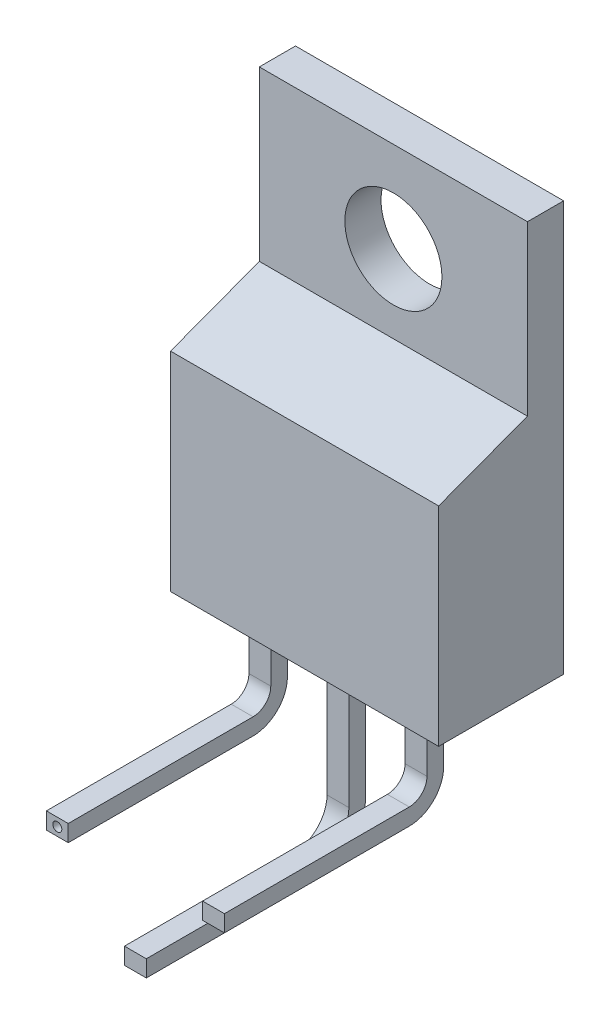
ISO-10303-21;
HEADER;
FILE_DESCRIPTION(('STEP AP214'),'2;1');
FILE_NAME('part.step','',(''),(''),'','','');
FILE_SCHEMA(('AUTOMOTIVE_DESIGN { 1 0 10303 214 1 1 1 1 }'));
ENDSEC;
DATA;
#1=APPLICATION_CONTEXT('core data for automotive mechanical design processes');
#2=APPLICATION_PROTOCOL_DEFINITION('international standard','automotive_design',2000,#1);
#3=PRODUCT_CONTEXT('',#1,'mechanical');
#4=PRODUCT('Part','Part','',(#3));
#5=PRODUCT_RELATED_PRODUCT_CATEGORY('part','',(#4));
#6=PRODUCT_DEFINITION_FORMATION('','',#4);
#7=PRODUCT_DEFINITION_CONTEXT('part definition',#1,'design');
#8=PRODUCT_DEFINITION('design','',#6,#7);
#9=PRODUCT_DEFINITION_SHAPE('','',#8);
#10=(LENGTH_UNIT() NAMED_UNIT(*) SI_UNIT(.MILLI.,.METRE.));
#11=(NAMED_UNIT(*) PLANE_ANGLE_UNIT() SI_UNIT($,.RADIAN.));
#12=(NAMED_UNIT(*) SI_UNIT($,.STERADIAN.) SOLID_ANGLE_UNIT());
#13=UNCERTAINTY_MEASURE_WITH_UNIT(LENGTH_MEASURE(1.E-05),#10,'distance_accuracy_value','');
#14=(GEOMETRIC_REPRESENTATION_CONTEXT(3) GLOBAL_UNCERTAINTY_ASSIGNED_CONTEXT((#13)) GLOBAL_UNIT_ASSIGNED_CONTEXT((#10,
#11,#12)) REPRESENTATION_CONTEXT('',''));
#15=CARTESIAN_POINT('',(0.,0.,0.));
#16=DIRECTION('',(0.,0.,1.));
#17=DIRECTION('',(1.,0.,0.));
#18=AXIS2_PLACEMENT_3D('',#15,#16,#17);
#19=CARTESIAN_POINT('',(-0.42,1.,-1.28));
#20=DIRECTION('',(0.,0.,-1.));
#21=DIRECTION('',(-1.,0.,0.));
#22=AXIS2_PLACEMENT_3D('',#19,#20,#21);
#23=PLANE('',#22);
#24=DIRECTION('',(0.,-1.,0.));
#25=VECTOR('',#24,1.);
#26=CARTESIAN_POINT('',(-0.0399999999999997,3.5,-1.28));
#27=LINE('',#26,#25);
#28=CARTESIAN_POINT('',(-0.0399999999999997,3.5,-1.28));
#29=VERTEX_POINT('',#28);
#30=CARTESIAN_POINT('',(-0.0399999999999997,1.,-1.28));
#31=VERTEX_POINT('',#30);
#32=EDGE_CURVE('E299',#29,#31,#27,.T.);
#33=ORIENTED_EDGE('',*,*,#32,.F.);
#34=DIRECTION('',(-1.,0.,0.));
#35=VECTOR('',#34,1.);
#36=CARTESIAN_POINT('',(-0.42,3.5,-1.28));
#37=LINE('',#36,#35);
#38=CARTESIAN_POINT('',(-0.880000000000001,3.5,-1.28));
#39=VERTEX_POINT('',#38);
#40=EDGE_CURVE('E418',#29,#39,#37,.T.);
#41=ORIENTED_EDGE('',*,*,#40,.T.);
#42=DIRECTION('',(0.,1.,0.));
#43=VECTOR('',#42,1.);
#44=CARTESIAN_POINT('',(-0.880000000000001,1.,-1.28));
#45=LINE('',#44,#43);
#46=CARTESIAN_POINT('',(-0.880000000000001,1.00000000000001,-1.28));
#47=VERTEX_POINT('',#46);
#48=EDGE_CURVE('E356',#47,#39,#45,.T.);
#49=ORIENTED_EDGE('',*,*,#48,.F.);
#50=DIRECTION('',(-1.,0.,0.));
#51=VECTOR('',#50,1.);
#52=CARTESIAN_POINT('',(-0.42,1.,-1.28));
#53=LINE('',#52,#51);
#54=EDGE_CURVE('E413',#31,#47,#53,.T.);
#55=ORIENTED_EDGE('',*,*,#54,.F.);
#56=EDGE_LOOP('',(#33,#41,#49,#55));
#57=FACE_BOUND('',#56,.T.);
#58=ADVANCED_FACE('F31',(#57),#23,.F.);
#59=CARTESIAN_POINT('',(-0.42,1.00000000000001,-1.92));
#60=DIRECTION('',(0.,0.,1.));
#61=DIRECTION('',(1.,0.,0.));
#62=AXIS2_PLACEMENT_3D('',#59,#60,#61);
#63=PLANE('',#62);
#64=DIRECTION('',(0.,1.,0.));
#65=VECTOR('',#64,1.);
#66=CARTESIAN_POINT('',(-0.0399999999999997,1.00000000000001,-1.92));
#67=LINE('',#66,#65);
#68=CARTESIAN_POINT('',(-0.0399999999999997,1.00000000000001,-1.92));
#69=VERTEX_POINT('',#68);
#70=CARTESIAN_POINT('',(-0.0399999999999997,3.5,-1.92));
#71=VERTEX_POINT('',#70);
#72=EDGE_CURVE('E294',#69,#71,#67,.T.);
#73=ORIENTED_EDGE('',*,*,#72,.F.);
#74=DIRECTION('',(1.,0.,0.));
#75=VECTOR('',#74,1.);
#76=CARTESIAN_POINT('',(-0.42,1.00000000000001,-1.92));
#77=LINE('',#76,#75);
#78=CARTESIAN_POINT('',(-0.880000000000001,1.00000000000001,-1.92));
#79=VERTEX_POINT('',#78);
#80=EDGE_CURVE('E410',#79,#69,#77,.T.);
#81=ORIENTED_EDGE('',*,*,#80,.F.);
#82=DIRECTION('',(0.,-1.,0.));
#83=VECTOR('',#82,1.);
#84=CARTESIAN_POINT('',(-0.880000000000001,3.5,-1.92));
#85=LINE('',#84,#83);
#86=CARTESIAN_POINT('',(-0.880000000000001,3.5,-1.92));
#87=VERTEX_POINT('',#86);
#88=EDGE_CURVE('E362',#87,#79,#85,.T.);
#89=ORIENTED_EDGE('',*,*,#88,.F.);
#90=DIRECTION('',(1.,0.,0.));
#91=VECTOR('',#90,1.);
#92=CARTESIAN_POINT('',(-0.42,3.5,-1.92));
#93=LINE('',#92,#91);
#94=EDGE_CURVE('E415',#87,#71,#93,.T.);
#95=ORIENTED_EDGE('',*,*,#94,.T.);
#96=EDGE_LOOP('',(#73,#81,#89,#95));
#97=FACE_BOUND('',#96,.T.);
#98=ADVANCED_FACE('F507',(#97),#63,.F.);
#99=CARTESIAN_POINT('',(0.,1.,-0.600000000000001));
#100=DIRECTION('',(1.,0.,0.));
#101=DIRECTION('',(0.,0.,-1.));
#102=AXIS2_PLACEMENT_3D('',#99,#100,#101);
#103=CYLINDRICAL_SURFACE('',#102,0.68);
#104=CARTESIAN_POINT('',(-0.0399999999999997,1.,-0.600000000000001));
#105=DIRECTION('',(-1.,0.,0.));
#106=DIRECTION('',(0.,0.,-1.));
#107=AXIS2_PLACEMENT_3D('',#104,#105,#106);
#108=CIRCLE('',#107,0.68);
#109=CARTESIAN_POINT('',(-0.0399999999999997,0.32,-0.600000000000001));
#110=VERTEX_POINT('',#109);
#111=EDGE_CURVE('E283',#31,#110,#108,.T.);
#112=ORIENTED_EDGE('',*,*,#111,.F.);
#113=ORIENTED_EDGE('',*,*,#54,.T.);
#114=CARTESIAN_POINT('',(-0.880000000000001,0.999999999999999,-0.600000000000001));
#115=DIRECTION('',(1.,0.,0.));
#116=DIRECTION('',(0.,-1.,0.));
#117=AXIS2_PLACEMENT_3D('',#114,#115,#116);
#118=CIRCLE('',#117,0.68);
#119=CARTESIAN_POINT('',(-0.88,0.32,-0.600000000000001));
#120=VERTEX_POINT('',#119);
#121=EDGE_CURVE('E353',#120,#47,#118,.T.);
#122=ORIENTED_EDGE('',*,*,#121,.F.);
#123=DIRECTION('',(-1.,0.,0.));
#124=VECTOR('',#123,1.);
#125=CARTESIAN_POINT('',(-0.42,0.32,-0.600000000000001));
#126=LINE('',#125,#124);
#127=EDGE_CURVE('E408',#110,#120,#126,.T.);
#128=ORIENTED_EDGE('',*,*,#127,.F.);
#129=EDGE_LOOP('',(#112,#113,#122,#128));
#130=FACE_BOUND('',#129,.T.);
#131=ADVANCED_FACE('F513',(#130),#103,.F.);
#132=CARTESIAN_POINT('',(0.,1.,-0.600000000000001));
#133=DIRECTION('',(1.,0.,0.));
#134=DIRECTION('',(0.,0.,-1.));
#135=AXIS2_PLACEMENT_3D('',#132,#133,#134);
#136=CYLINDRICAL_SURFACE('',#135,1.32);
#137=CARTESIAN_POINT('',(-0.0399999999999997,1.,-0.600000000000001));
#138=DIRECTION('',(1.,0.,0.));
#139=DIRECTION('',(0.,0.,-1.));
#140=AXIS2_PLACEMENT_3D('',#137,#138,#139);
#141=CIRCLE('',#140,1.32);
#142=CARTESIAN_POINT('',(-0.0399999999999997,-0.32,-0.600000000000001));
#143=VERTEX_POINT('',#142);
#144=EDGE_CURVE('E292',#143,#69,#141,.T.);
#145=ORIENTED_EDGE('',*,*,#144,.F.);
#146=DIRECTION('',(1.,0.,0.));
#147=VECTOR('',#146,1.);
#148=CARTESIAN_POINT('',(-0.42,-0.32,-0.600000000000001));
#149=LINE('',#148,#147);
#150=CARTESIAN_POINT('',(-0.88,-0.32,-0.600000000000001));
#151=VERTEX_POINT('',#150);
#152=EDGE_CURVE('E405',#151,#143,#149,.T.);
#153=ORIENTED_EDGE('',*,*,#152,.F.);
#154=CARTESIAN_POINT('',(-0.880000000000001,0.999999999999999,-0.600000000000001));
#155=DIRECTION('',(-1.,0.,0.));
#156=DIRECTION('',(0.,-1.,0.));
#157=AXIS2_PLACEMENT_3D('',#154,#155,#156);
#158=CIRCLE('',#157,1.32);
#159=EDGE_CURVE('E341',#79,#151,#158,.T.);
#160=ORIENTED_EDGE('',*,*,#159,.F.);
#161=ORIENTED_EDGE('',*,*,#80,.T.);
#162=EDGE_LOOP('',(#145,#153,#160,#161));
#163=FACE_BOUND('',#162,.T.);
#164=ADVANCED_FACE('F658',(#163),#136,.T.);
#165=CARTESIAN_POINT('',(-0.42,0.32,-0.600000000000001));
#166=DIRECTION('',(0.,1.,0.));
#167=DIRECTION('',(-1.,0.,0.));
#168=AXIS2_PLACEMENT_3D('',#165,#166,#167);
#169=PLANE('',#168);
#170=DIRECTION('',(-1.,0.,0.));
#171=VECTOR('',#170,1.);
#172=CARTESIAN_POINT('',(0.42,0.32,6.5));
#173=LINE('',#172,#171);
#174=CARTESIAN_POINT('',(-0.0399999999999997,0.32,6.5));
#175=VERTEX_POINT('',#174);
#176=CARTESIAN_POINT('',(-0.88,0.32,6.5));
#177=VERTEX_POINT('',#176);
#178=EDGE_CURVE('E370',#175,#177,#173,.T.);
#179=ORIENTED_EDGE('',*,*,#178,.F.);
#180=DIRECTION('',(0.,0.,1.));
#181=VECTOR('',#180,1.);
#182=CARTESIAN_POINT('',(-0.0399999999999997,0.32,-0.600000000000001));
#183=LINE('',#182,#181);
#184=EDGE_CURVE('E46',#110,#175,#183,.T.);
#185=ORIENTED_EDGE('',*,*,#184,.F.);
#186=ORIENTED_EDGE('',*,*,#127,.T.);
#187=DIRECTION('',(0.,0.,-1.));
#188=VECTOR('',#187,1.);
#189=CARTESIAN_POINT('',(-0.88,0.32,6.5));
#190=LINE('',#189,#188);
#191=EDGE_CURVE('E350',#177,#120,#190,.T.);
#192=ORIENTED_EDGE('',*,*,#191,.F.);
#193=EDGE_LOOP('',(#179,#185,#186,#192));
#194=FACE_BOUND('',#193,.T.);
#195=ADVANCED_FACE('F650',(#194),#169,.T.);
#196=CARTESIAN_POINT('',(-0.42,-0.32,-0.600000000000001));
#197=DIRECTION('',(0.,-1.,0.));
#198=DIRECTION('',(1.,0.,0.));
#199=AXIS2_PLACEMENT_3D('',#196,#197,#198);
#200=PLANE('',#199);
#201=ORIENTED_EDGE('',*,*,#152,.T.);
#202=DIRECTION('',(0.,0.,-1.));
#203=VECTOR('',#202,1.);
#204=CARTESIAN_POINT('',(-0.0399999999999997,-0.32,6.5));
#205=LINE('',#204,#203);
#206=CARTESIAN_POINT('',(-0.0399999999999997,-0.32,6.5));
#207=VERTEX_POINT('',#206);
#208=EDGE_CURVE('E290',#207,#143,#205,.T.);
#209=ORIENTED_EDGE('',*,*,#208,.F.);
#210=DIRECTION('',(1.,0.,0.));
#211=VECTOR('',#210,1.);
#212=CARTESIAN_POINT('',(-0.42,-0.32,6.5));
#213=LINE('',#212,#211);
#214=CARTESIAN_POINT('',(-0.88,-0.32,6.5));
#215=VERTEX_POINT('',#214);
#216=EDGE_CURVE('E372',#215,#207,#213,.T.);
#217=ORIENTED_EDGE('',*,*,#216,.F.);
#218=DIRECTION('',(0.,0.,1.));
#219=VECTOR('',#218,1.);
#220=CARTESIAN_POINT('',(-0.88,-0.32,-0.600000000000001));
#221=LINE('',#220,#219);
#222=EDGE_CURVE('E344',#151,#215,#221,.T.);
#223=ORIENTED_EDGE('',*,*,#222,.F.);
#224=EDGE_LOOP('',(#201,#209,#217,#223));
#225=FACE_BOUND('',#224,.T.);
#226=ADVANCED_FACE('F642',(#225),#200,.T.);
#227=CARTESIAN_POINT('',(0.42,0.32,6.5));
#228=DIRECTION('',(0.,0.,-1.));
#229=DIRECTION('',(-1.,0.,0.));
#230=AXIS2_PLACEMENT_3D('',#227,#228,#229);
#231=PLANE('',#230);
#232=CARTESIAN_POINT('',(-0.46,0.,6.5));
#233=DIRECTION('',(0.,0.,1.));
#234=DIRECTION('',(1.,0.,0.));
#235=AXIS2_PLACEMENT_3D('',#232,#233,#234);
#236=CIRCLE('',#235,0.172950305711624);
#237=CARTESIAN_POINT('',(-0.287049694288376,0.,6.5));
#238=VERTEX_POINT('',#237);
#239=EDGE_CURVE('E267',#238,#238,#236,.T.);
#240=ORIENTED_EDGE('',*,*,#239,.F.);
#241=EDGE_LOOP('',(#240));
#242=FACE_BOUND('',#241,.T.);
#243=DIRECTION('',(0.,-1.,0.));
#244=VECTOR('',#243,1.);
#245=CARTESIAN_POINT('',(-0.0399999999999997,0.32,6.5));
#246=LINE('',#245,#244);
#247=EDGE_CURVE('E288',#175,#207,#246,.T.);
#248=ORIENTED_EDGE('',*,*,#247,.F.);
#249=ORIENTED_EDGE('',*,*,#178,.T.);
#250=DIRECTION('',(0.,1.,0.));
#251=VECTOR('',#250,1.);
#252=CARTESIAN_POINT('',(-0.88,-0.32,6.5));
#253=LINE('',#252,#251);
#254=EDGE_CURVE('E347',#215,#177,#253,.T.);
#255=ORIENTED_EDGE('',*,*,#254,.F.);
#256=ORIENTED_EDGE('',*,*,#216,.T.);
#257=EDGE_LOOP('',(#248,#249,#255,#256));
#258=FACE_BOUND('',#257,.T.);
#259=ADVANCED_FACE('F633',(#242,#258),#231,.F.);
#260=CARTESIAN_POINT('',(5.5,1.00000000000001,-1.92));
#261=DIRECTION('',(0.,0.,1.));
#262=DIRECTION('',(1.,0.,0.));
#263=AXIS2_PLACEMENT_3D('',#260,#261,#262);
#264=PLANE('',#263);
#265=DIRECTION('',(0.,-1.,0.));
#266=VECTOR('',#265,1.);
#267=CARTESIAN_POINT('',(5.12,3.5,-1.92));
#268=LINE('',#267,#266);
#269=CARTESIAN_POINT('',(5.12,3.5,-1.92));
#270=VERTEX_POINT('',#269);
#271=CARTESIAN_POINT('',(5.12,1.00000000000001,-1.92));
#272=VERTEX_POINT('',#271);
#273=EDGE_CURVE('E315',#270,#272,#268,.T.);
#274=ORIENTED_EDGE('',*,*,#273,.F.);
#275=DIRECTION('',(1.,0.,0.));
#276=VECTOR('',#275,1.);
#277=CARTESIAN_POINT('',(5.5,3.5,-1.92));
#278=LINE('',#277,#276);
#279=CARTESIAN_POINT('',(5.96,3.5,-1.92));
#280=VERTEX_POINT('',#279);
#281=EDGE_CURVE('E403',#270,#280,#278,.T.);
#282=ORIENTED_EDGE('',*,*,#281,.T.);
#283=DIRECTION('',(0.,1.,0.));
#284=VECTOR('',#283,1.);
#285=CARTESIAN_POINT('',(5.96,1.00000000000001,-1.92));
#286=LINE('',#285,#284);
#287=CARTESIAN_POINT('',(5.96,1.00000000000001,-1.92));
#288=VERTEX_POINT('',#287);
#289=EDGE_CURVE('E332',#288,#280,#286,.T.);
#290=ORIENTED_EDGE('',*,*,#289,.F.);
#291=DIRECTION('',(1.,0.,0.));
#292=VECTOR('',#291,1.);
#293=CARTESIAN_POINT('',(5.5,1.00000000000001,-1.92));
#294=LINE('',#293,#292);
#295=EDGE_CURVE('E398',#272,#288,#294,.T.);
#296=ORIENTED_EDGE('',*,*,#295,.F.);
#297=EDGE_LOOP('',(#274,#282,#290,#296));
#298=FACE_BOUND('',#297,.T.);
#299=ADVANCED_FACE('F625',(#298),#264,.F.);
#300=CARTESIAN_POINT('',(5.5,1.,-1.28));
#301=DIRECTION('',(0.,0.,-1.));
#302=DIRECTION('',(-1.,0.,0.));
#303=AXIS2_PLACEMENT_3D('',#300,#301,#302);
#304=PLANE('',#303);
#305=DIRECTION('',(0.,1.,0.));
#306=VECTOR('',#305,1.);
#307=CARTESIAN_POINT('',(5.12,1.,-1.28));
#308=LINE('',#307,#306);
#309=CARTESIAN_POINT('',(5.12,1.,-1.28));
#310=VERTEX_POINT('',#309);
#311=CARTESIAN_POINT('',(5.12,3.5,-1.28));
#312=VERTEX_POINT('',#311);
#313=EDGE_CURVE('E310',#310,#312,#308,.T.);
#314=ORIENTED_EDGE('',*,*,#313,.F.);
#315=DIRECTION('',(-1.,0.,0.));
#316=VECTOR('',#315,1.);
#317=CARTESIAN_POINT('',(5.5,1.,-1.28));
#318=LINE('',#317,#316);
#319=CARTESIAN_POINT('',(5.96,1.,-1.28));
#320=VERTEX_POINT('',#319);
#321=EDGE_CURVE('E395',#320,#310,#318,.T.);
#322=ORIENTED_EDGE('',*,*,#321,.F.);
#323=DIRECTION('',(0.,-1.,0.));
#324=VECTOR('',#323,1.);
#325=CARTESIAN_POINT('',(5.96,3.5,-1.28));
#326=LINE('',#325,#324);
#327=CARTESIAN_POINT('',(5.96,3.5,-1.28));
#328=VERTEX_POINT('',#327);
#329=EDGE_CURVE('E338',#328,#320,#326,.T.);
#330=ORIENTED_EDGE('',*,*,#329,.F.);
#331=DIRECTION('',(-1.,0.,0.));
#332=VECTOR('',#331,1.);
#333=CARTESIAN_POINT('',(5.5,3.5,-1.28));
#334=LINE('',#333,#332);
#335=EDGE_CURVE('E400',#328,#312,#334,.T.);
#336=ORIENTED_EDGE('',*,*,#335,.T.);
#337=EDGE_LOOP('',(#314,#322,#330,#336));
#338=FACE_BOUND('',#337,.T.);
#339=ADVANCED_FACE('F617',(#338),#304,.F.);
#340=CARTESIAN_POINT('',(0.,1.,-0.600000000000001));
#341=DIRECTION('',(1.,0.,0.));
#342=DIRECTION('',(0.,0.,-1.));
#343=AXIS2_PLACEMENT_3D('',#340,#341,#342);
#344=CYLINDRICAL_SURFACE('',#343,1.32);
#345=CARTESIAN_POINT('',(5.12,1.,-0.600000000000001));
#346=DIRECTION('',(-1.,0.,0.));
#347=DIRECTION('',(0.,0.,1.));
#348=AXIS2_PLACEMENT_3D('',#345,#346,#347);
#349=CIRCLE('',#348,1.32);
#350=CARTESIAN_POINT('',(5.12,-0.32,-0.600000000000001));
#351=VERTEX_POINT('',#350);
#352=EDGE_CURVE('E301',#272,#351,#349,.T.);
#353=ORIENTED_EDGE('',*,*,#352,.F.);
#354=ORIENTED_EDGE('',*,*,#295,.T.);
#355=CARTESIAN_POINT('',(5.96,1.,-0.600000000000001));
#356=DIRECTION('',(1.,0.,0.));
#357=DIRECTION('',(0.,0.,-1.));
#358=AXIS2_PLACEMENT_3D('',#355,#356,#357);
#359=CIRCLE('',#358,1.32);
#360=CARTESIAN_POINT('',(5.96,-0.320000000000001,-0.600000000000001));
#361=VERTEX_POINT('',#360);
#362=EDGE_CURVE('E329',#361,#288,#359,.T.);
#363=ORIENTED_EDGE('',*,*,#362,.F.);
#364=DIRECTION('',(1.,0.,0.));
#365=VECTOR('',#364,1.);
#366=CARTESIAN_POINT('',(5.5,-0.320000000000001,-0.600000000000001));
#367=LINE('',#366,#365);
#368=EDGE_CURVE('E393',#351,#361,#367,.T.);
#369=ORIENTED_EDGE('',*,*,#368,.F.);
#370=EDGE_LOOP('',(#353,#354,#363,#369));
#371=FACE_BOUND('',#370,.T.);
#372=ADVANCED_FACE('F609',(#371),#344,.T.);
#373=CARTESIAN_POINT('',(0.,1.,-0.600000000000001));
#374=DIRECTION('',(1.,0.,0.));
#375=DIRECTION('',(0.,0.,-1.));
#376=AXIS2_PLACEMENT_3D('',#373,#374,#375);
#377=CYLINDRICAL_SURFACE('',#376,0.679999999999999);
#378=CARTESIAN_POINT('',(5.12,1.,-0.600000000000001));
#379=DIRECTION('',(1.,0.,0.));
#380=DIRECTION('',(0.,0.,1.));
#381=AXIS2_PLACEMENT_3D('',#378,#379,#380);
#382=CIRCLE('',#381,0.679999999999999);
#383=CARTESIAN_POINT('',(5.12,0.32,-0.600000000000001));
#384=VERTEX_POINT('',#383);
#385=EDGE_CURVE('E308',#384,#310,#382,.T.);
#386=ORIENTED_EDGE('',*,*,#385,.F.);
#387=DIRECTION('',(-1.,0.,0.));
#388=VECTOR('',#387,1.);
#389=CARTESIAN_POINT('',(5.5,0.320000000000001,-0.600000000000001));
#390=LINE('',#389,#388);
#391=CARTESIAN_POINT('',(5.96,0.320000000000001,-0.600000000000001));
#392=VERTEX_POINT('',#391);
#393=EDGE_CURVE('E390',#392,#384,#390,.T.);
#394=ORIENTED_EDGE('',*,*,#393,.F.);
#395=CARTESIAN_POINT('',(5.96,1.,-0.600000000000001));
#396=DIRECTION('',(-1.,0.,0.));
#397=DIRECTION('',(0.,0.,-1.));
#398=AXIS2_PLACEMENT_3D('',#395,#396,#397);
#399=CIRCLE('',#398,0.679999999999999);
#400=EDGE_CURVE('E317',#320,#392,#399,.T.);
#401=ORIENTED_EDGE('',*,*,#400,.F.);
#402=ORIENTED_EDGE('',*,*,#321,.T.);
#403=EDGE_LOOP('',(#386,#394,#401,#402));
#404=FACE_BOUND('',#403,.T.);
#405=ADVANCED_FACE('F601',(#404),#377,.F.);
#406=CARTESIAN_POINT('',(5.5,0.320000000000001,-0.600000000000001));
#407=DIRECTION('',(0.,1.,0.));
#408=DIRECTION('',(-1.,0.,0.));
#409=AXIS2_PLACEMENT_3D('',#406,#407,#408);
#410=PLANE('',#409);
#411=ORIENTED_EDGE('',*,*,#393,.T.);
#412=DIRECTION('',(0.,0.,-1.));
#413=VECTOR('',#412,1.);
#414=CARTESIAN_POINT('',(5.12,0.32,6.5));
#415=LINE('',#414,#413);
#416=CARTESIAN_POINT('',(5.12,0.32,6.5));
#417=VERTEX_POINT('',#416);
#418=EDGE_CURVE('E306',#417,#384,#415,.T.);
#419=ORIENTED_EDGE('',*,*,#418,.F.);
#420=DIRECTION('',(-1.,0.,0.));
#421=VECTOR('',#420,1.);
#422=CARTESIAN_POINT('',(5.5,0.320000000000001,6.5));
#423=LINE('',#422,#421);
#424=CARTESIAN_POINT('',(5.96,0.320000000000001,6.5));
#425=VERTEX_POINT('',#424);
#426=EDGE_CURVE('E365',#425,#417,#423,.T.);
#427=ORIENTED_EDGE('',*,*,#426,.F.);
#428=DIRECTION('',(0.,0.,1.));
#429=VECTOR('',#428,1.);
#430=CARTESIAN_POINT('',(5.96,0.320000000000001,-0.600000000000001));
#431=LINE('',#430,#429);
#432=EDGE_CURVE('E320',#392,#425,#431,.T.);
#433=ORIENTED_EDGE('',*,*,#432,.F.);
#434=EDGE_LOOP('',(#411,#419,#427,#433));
#435=FACE_BOUND('',#434,.T.);
#436=ADVANCED_FACE('F593',(#435),#410,.T.);
#437=CARTESIAN_POINT('',(5.5,-0.320000000000001,-0.600000000000001));
#438=DIRECTION('',(0.,-1.,0.));
#439=DIRECTION('',(1.,0.,0.));
#440=AXIS2_PLACEMENT_3D('',#437,#438,#439);
#441=PLANE('',#440);
#442=DIRECTION('',(1.,0.,0.));
#443=VECTOR('',#442,1.);
#444=CARTESIAN_POINT('',(4.66,-0.32,6.5));
#445=LINE('',#444,#443);
#446=CARTESIAN_POINT('',(5.12,-0.320000000000001,6.5));
#447=VERTEX_POINT('',#446);
#448=CARTESIAN_POINT('',(5.96,-0.320000000000001,6.5));
#449=VERTEX_POINT('',#448);
#450=EDGE_CURVE('E368',#447,#449,#445,.T.);
#451=ORIENTED_EDGE('',*,*,#450,.F.);
#452=DIRECTION('',(0.,0.,1.));
#453=VECTOR('',#452,1.);
#454=CARTESIAN_POINT('',(5.12,-0.32,-0.600000000000001));
#455=LINE('',#454,#453);
#456=EDGE_CURVE('E54',#351,#447,#455,.T.);
#457=ORIENTED_EDGE('',*,*,#456,.F.);
#458=ORIENTED_EDGE('',*,*,#368,.T.);
#459=DIRECTION('',(0.,0.,-1.));
#460=VECTOR('',#459,1.);
#461=CARTESIAN_POINT('',(5.96,-0.320000000000001,6.5));
#462=LINE('',#461,#460);
#463=EDGE_CURVE('E326',#449,#361,#462,.T.);
#464=ORIENTED_EDGE('',*,*,#463,.F.);
#465=EDGE_LOOP('',(#451,#457,#458,#464));
#466=FACE_BOUND('',#465,.T.);
#467=ADVANCED_FACE('F584',(#466),#441,.T.);
#468=CARTESIAN_POINT('',(5.5,0.320000000000001,6.5));
#469=DIRECTION('',(0.,0.,1.));
#470=DIRECTION('',(1.,0.,0.));
#471=AXIS2_PLACEMENT_3D('',#468,#469,#470);
#472=PLANE('',#471);
#473=ORIENTED_EDGE('',*,*,#426,.T.);
#474=DIRECTION('',(0.,1.,0.));
#475=VECTOR('',#474,1.);
#476=CARTESIAN_POINT('',(5.12,-0.32,6.5));
#477=LINE('',#476,#475);
#478=EDGE_CURVE('E304',#447,#417,#477,.T.);
#479=ORIENTED_EDGE('',*,*,#478,.F.);
#480=ORIENTED_EDGE('',*,*,#450,.T.);
#481=DIRECTION('',(0.,-1.,0.));
#482=VECTOR('',#481,1.);
#483=CARTESIAN_POINT('',(5.96,0.320000000000001,6.5));
#484=LINE('',#483,#482);
#485=EDGE_CURVE('E323',#425,#449,#484,.T.);
#486=ORIENTED_EDGE('',*,*,#485,.F.);
#487=EDGE_LOOP('',(#473,#479,#480,#486));
#488=FACE_BOUND('',#487,.T.);
#489=ADVANCED_FACE('F537',(#488),#472,.T.);
#490=CARTESIAN_POINT('',(-2.61,3.5,-4.8));
#491=DIRECTION('',(0.,-1.,0.));
#492=DIRECTION('',(0.,0.,-1.));
#493=AXIS2_PLACEMENT_3D('',#490,#491,#492);
#494=PLANE('',#493);
#495=ORIENTED_EDGE('',*,*,#40,.F.);
#496=DIRECTION('',(0.,0.,1.));
#497=VECTOR('',#496,1.);
#498=CARTESIAN_POINT('',(-0.0399999999999997,3.5,-1.92));
#499=LINE('',#498,#497);
#500=EDGE_CURVE('E297',#71,#29,#499,.T.);
#501=ORIENTED_EDGE('',*,*,#500,.F.);
#502=ORIENTED_EDGE('',*,*,#94,.F.);
#503=DIRECTION('',(0.,0.,-1.));
#504=VECTOR('',#503,1.);
#505=CARTESIAN_POINT('',(-0.880000000000001,3.5,-1.28));
#506=LINE('',#505,#504);
#507=EDGE_CURVE('E359',#39,#87,#506,.T.);
#508=ORIENTED_EDGE('',*,*,#507,.F.);
#509=EDGE_LOOP('',(#495,#501,#502,#508));
#510=FACE_BOUND('',#509,.T.);
#511=ORIENTED_EDGE('',*,*,#281,.F.);
#512=DIRECTION('',(0.,0.,-1.));
#513=VECTOR('',#512,1.);
#514=CARTESIAN_POINT('',(5.12,3.5,-1.28));
#515=LINE('',#514,#513);
#516=EDGE_CURVE('E313',#312,#270,#515,.T.);
#517=ORIENTED_EDGE('',*,*,#516,.F.);
#518=ORIENTED_EDGE('',*,*,#335,.F.);
#519=DIRECTION('',(0.,0.,1.));
#520=VECTOR('',#519,1.);
#521=CARTESIAN_POINT('',(5.96,3.5,-1.92));
#522=LINE('',#521,#520);
#523=EDGE_CURVE('E335',#280,#328,#522,.T.);
#524=ORIENTED_EDGE('',*,*,#523,.F.);
#525=EDGE_LOOP('',(#511,#517,#518,#524));
#526=FACE_BOUND('',#525,.T.);
#527=DIRECTION('',(0.,0.,-1.));
#528=VECTOR('',#527,1.);
#529=CARTESIAN_POINT('',(2.12,3.5,-4.8));
#530=LINE('',#529,#528);
#531=CARTESIAN_POINT('',(2.12,3.5,-1.28));
#532=VERTEX_POINT('',#531);
#533=CARTESIAN_POINT('',(2.12,3.5,-1.92));
#534=VERTEX_POINT('',#533);
#535=EDGE_CURVE('E11',#532,#534,#530,.T.);
#536=ORIENTED_EDGE('',*,*,#535,.F.);
#537=DIRECTION('',(1.,0.,0.));
#538=VECTOR('',#537,1.);
#539=CARTESIAN_POINT('',(-2.61,3.5,-1.28));
#540=LINE('',#539,#538);
#541=CARTESIAN_POINT('',(2.96,3.5,-1.28));
#542=VERTEX_POINT('',#541);
#543=EDGE_CURVE('E39',#532,#542,#540,.T.);
#544=ORIENTED_EDGE('',*,*,#543,.T.);
#545=DIRECTION('',(0.,0.,1.));
#546=VECTOR('',#545,1.);
#547=CARTESIAN_POINT('',(2.96,3.5,-4.8));
#548=LINE('',#547,#546);
#549=CARTESIAN_POINT('',(2.96,3.5,-1.92));
#550=VERTEX_POINT('',#549);
#551=EDGE_CURVE('E468',#550,#542,#548,.T.);
#552=ORIENTED_EDGE('',*,*,#551,.F.);
#553=DIRECTION('',(-1.,0.,0.));
#554=VECTOR('',#553,1.);
#555=CARTESIAN_POINT('',(-2.61,3.5,-1.92));
#556=LINE('',#555,#554);
#557=EDGE_CURVE('E473',#550,#534,#556,.T.);
#558=ORIENTED_EDGE('',*,*,#557,.T.);
#559=EDGE_LOOP('',(#536,#544,#552,#558));
#560=FACE_BOUND('',#559,.T.);
#561=DIRECTION('',(0.,0.,1.));
#562=VECTOR('',#561,1.);
#563=CARTESIAN_POINT('',(-2.61,3.5,0.));
#564=LINE('',#563,#562);
#565=CARTESIAN_POINT('',(-2.61,3.5,-4.8));
#566=VERTEX_POINT('',#565);
#567=CARTESIAN_POINT('',(-2.61,3.5,0.));
#568=VERTEX_POINT('',#567);
#569=EDGE_CURVE('E441',#566,#568,#564,.T.);
#570=ORIENTED_EDGE('',*,*,#569,.F.);
#571=DIRECTION('',(-1.,0.,0.));
#572=VECTOR('',#571,1.);
#573=CARTESIAN_POINT('',(-2.61,3.5,-4.8));
#574=LINE('',#573,#572);
#575=CARTESIAN_POINT('',(7.69,3.5,-4.8));
#576=VERTEX_POINT('',#575);
#577=EDGE_CURVE('E446',#576,#566,#574,.T.);
#578=ORIENTED_EDGE('',*,*,#577,.F.);
#579=DIRECTION('',(0.,0.,-1.));
#580=VECTOR('',#579,1.);
#581=CARTESIAN_POINT('',(7.69,3.5,0.));
#582=LINE('',#581,#580);
#583=CARTESIAN_POINT('',(7.69,3.5,0.));
#584=VERTEX_POINT('',#583);
#585=EDGE_CURVE('E456',#584,#576,#582,.T.);
#586=ORIENTED_EDGE('',*,*,#585,.F.);
#587=DIRECTION('',(1.,0.,0.));
#588=VECTOR('',#587,1.);
#589=CARTESIAN_POINT('',(-2.61,3.5,0.));
#590=LINE('',#589,#588);
#591=EDGE_CURVE('E453',#568,#584,#590,.T.);
#592=ORIENTED_EDGE('',*,*,#591,.F.);
#593=EDGE_LOOP('',(#570,#578,#586,#592));
#594=FACE_BOUND('',#593,.T.);
#595=ADVANCED_FACE('F476',(#510,#526,#560,#594),#494,.T.);
#596=CARTESIAN_POINT('',(-2.61,19.25,0.));
#597=DIRECTION('',(1.,0.,0.));
#598=DIRECTION('',(0.,0.,-1.));
#599=AXIS2_PLACEMENT_3D('',#596,#597,#598);
#600=PLANE('',#599);
#601=DIRECTION('',(0.,-0.351424300429918,0.936216300364047));
#602=VECTOR('',#601,1.);
#603=CARTESIAN_POINT('',(-2.61,12.78,-3.40999999999988));
#604=LINE('',#603,#602);
#605=CARTESIAN_POINT('',(-2.61,12.78,-3.40999999999988));
#606=VERTEX_POINT('',#605);
#607=CARTESIAN_POINT('',(-2.61,11.5,0.));
#608=VERTEX_POINT('',#607);
#609=EDGE_CURVE('E433',#606,#608,#604,.T.);
#610=ORIENTED_EDGE('',*,*,#609,.F.);
#611=DIRECTION('',(0.,-1.,0.));
#612=VECTOR('',#611,1.);
#613=CARTESIAN_POINT('',(-2.61,19.25,-3.40999999999988));
#614=LINE('',#613,#612);
#615=CARTESIAN_POINT('',(-2.61,19.25,-3.40999999999988));
#616=VERTEX_POINT('',#615);
#617=EDGE_CURVE('E431',#616,#606,#614,.T.);
#618=ORIENTED_EDGE('',*,*,#617,.F.);
#619=DIRECTION('',(0.,0.,1.));
#620=VECTOR('',#619,1.);
#621=CARTESIAN_POINT('',(-2.61,19.25,0.));
#622=LINE('',#621,#620);
#623=CARTESIAN_POINT('',(-2.61,19.25,-4.8));
#624=VERTEX_POINT('',#623);
#625=EDGE_CURVE('E442',#624,#616,#622,.T.);
#626=ORIENTED_EDGE('',*,*,#625,.F.);
#627=DIRECTION('',(0.,-1.,0.));
#628=VECTOR('',#627,1.);
#629=CARTESIAN_POINT('',(-2.61,19.25,-4.8));
#630=LINE('',#629,#628);
#631=EDGE_CURVE('E450',#624,#566,#630,.T.);
#632=ORIENTED_EDGE('',*,*,#631,.T.);
#633=ORIENTED_EDGE('',*,*,#569,.T.);
#634=DIRECTION('',(0.,-1.,0.));
#635=VECTOR('',#634,1.);
#636=CARTESIAN_POINT('',(-2.61,19.25,0.));
#637=LINE('',#636,#635);
#638=EDGE_CURVE('E466',#608,#568,#637,.T.);
#639=ORIENTED_EDGE('',*,*,#638,.F.);
#640=EDGE_LOOP('',(#610,#618,#626,#632,#633,#639));
#641=FACE_BOUND('',#640,.T.);
#642=ADVANCED_FACE('F33',(#641),#600,.F.);
#643=CARTESIAN_POINT('',(-2.61,19.25,0.));
#644=DIRECTION('',(0.,0.,-1.));
#645=DIRECTION('',(-1.,0.,0.));
#646=AXIS2_PLACEMENT_3D('',#643,#644,#645);
#647=PLANE('',#646);
#648=DIRECTION('',(0.,-1.,0.));
#649=VECTOR('',#648,1.);
#650=CARTESIAN_POINT('',(7.69,19.25,0.));
#651=LINE('',#650,#649);
#652=CARTESIAN_POINT('',(7.69,11.5,0.));
#653=VERTEX_POINT('',#652);
#654=EDGE_CURVE('E464',#653,#584,#651,.T.);
#655=ORIENTED_EDGE('',*,*,#654,.F.);
#656=DIRECTION('',(1.,0.,0.));
#657=VECTOR('',#656,1.);
#658=CARTESIAN_POINT('',(-11.0770301759235,11.5,0.));
#659=LINE('',#658,#657);
#660=EDGE_CURVE('E430',#608,#653,#659,.T.);
#661=ORIENTED_EDGE('',*,*,#660,.F.);
#662=ORIENTED_EDGE('',*,*,#638,.T.);
#663=ORIENTED_EDGE('',*,*,#591,.T.);
#664=EDGE_LOOP('',(#655,#661,#662,#663));
#665=FACE_BOUND('',#664,.T.);
#666=ADVANCED_FACE('F544',(#665),#647,.F.);
#667=CARTESIAN_POINT('',(7.69,19.25,0.));
#668=DIRECTION('',(-1.,0.,0.));
#669=DIRECTION('',(0.,0.,1.));
#670=AXIS2_PLACEMENT_3D('',#667,#668,#669);
#671=PLANE('',#670);
#672=DIRECTION('',(0.,0.,-1.));
#673=VECTOR('',#672,1.);
#674=CARTESIAN_POINT('',(7.69,19.25,0.));
#675=LINE('',#674,#673);
#676=CARTESIAN_POINT('',(7.69,19.25,-3.40999999999988));
#677=VERTEX_POINT('',#676);
#678=CARTESIAN_POINT('',(7.69,19.25,-4.8));
#679=VERTEX_POINT('',#678);
#680=EDGE_CURVE('E445',#677,#679,#675,.T.);
#681=ORIENTED_EDGE('',*,*,#680,.F.);
#682=DIRECTION('',(0.,-1.,0.));
#683=VECTOR('',#682,1.);
#684=CARTESIAN_POINT('',(7.69,19.25,-3.40999999999988));
#685=LINE('',#684,#683);
#686=CARTESIAN_POINT('',(7.69,12.78,-3.40999999999988));
#687=VERTEX_POINT('',#686);
#688=EDGE_CURVE('E424',#677,#687,#685,.T.);
#689=ORIENTED_EDGE('',*,*,#688,.T.);
#690=DIRECTION('',(0.,-0.351424300429918,0.936216300364047));
#691=VECTOR('',#690,1.);
#692=CARTESIAN_POINT('',(7.69,12.78,-3.40999999999988));
#693=LINE('',#692,#691);
#694=EDGE_CURVE('E427',#687,#653,#693,.T.);
#695=ORIENTED_EDGE('',*,*,#694,.T.);
#696=ORIENTED_EDGE('',*,*,#654,.T.);
#697=ORIENTED_EDGE('',*,*,#585,.T.);
#698=DIRECTION('',(0.,-1.,0.));
#699=VECTOR('',#698,1.);
#700=CARTESIAN_POINT('',(7.69,19.25,-4.8));
#701=LINE('',#700,#699);
#702=EDGE_CURVE('E461',#679,#576,#701,.T.);
#703=ORIENTED_EDGE('',*,*,#702,.F.);
#704=EDGE_LOOP('',(#681,#689,#695,#696,#697,#703));
#705=FACE_BOUND('',#704,.T.);
#706=ADVANCED_FACE('F541',(#705),#671,.F.);
#707=CARTESIAN_POINT('',(-2.61,19.25,-4.8));
#708=DIRECTION('',(0.,0.,1.));
#709=DIRECTION('',(1.,0.,0.));
#710=AXIS2_PLACEMENT_3D('',#707,#708,#709);
#711=PLANE('',#710);
#712=CARTESIAN_POINT('',(2.54,15.77,-4.8));
#713=DIRECTION('',(0.,0.,1.));
#714=DIRECTION('',(1.,0.,0.));
#715=AXIS2_PLACEMENT_3D('',#712,#713,#714);
#716=CIRCLE('',#715,1.865);
#717=CARTESIAN_POINT('',(4.405,15.77,-4.8));
#718=VERTEX_POINT('',#717);
#719=EDGE_CURVE('E420',#718,#718,#716,.F.);
#720=ORIENTED_EDGE('',*,*,#719,.F.);
#721=EDGE_LOOP('',(#720));
#722=FACE_BOUND('',#721,.T.);
#723=ORIENTED_EDGE('',*,*,#577,.T.);
#724=ORIENTED_EDGE('',*,*,#631,.F.);
#725=DIRECTION('',(-1.,0.,0.));
#726=VECTOR('',#725,1.);
#727=CARTESIAN_POINT('',(-2.61,19.25,-4.8));
#728=LINE('',#727,#726);
#729=EDGE_CURVE('E448',#679,#624,#728,.T.);
#730=ORIENTED_EDGE('',*,*,#729,.F.);
#731=ORIENTED_EDGE('',*,*,#702,.T.);
#732=EDGE_LOOP('',(#723,#724,#730,#731));
#733=FACE_BOUND('',#732,.T.);
#734=ADVANCED_FACE('F533',(#722,#733),#711,.F.);
#735=CARTESIAN_POINT('',(-2.61,19.25,-4.8));
#736=DIRECTION('',(0.,-1.,0.));
#737=DIRECTION('',(0.,0.,-1.));
#738=AXIS2_PLACEMENT_3D('',#735,#736,#737);
#739=PLANE('',#738);
#740=ORIENTED_EDGE('',*,*,#625,.T.);
#741=DIRECTION('',(1.,0.,0.));
#742=VECTOR('',#741,1.);
#743=CARTESIAN_POINT('',(-11.0770301759235,19.25,-3.40999999999988));
#744=LINE('',#743,#742);
#745=EDGE_CURVE('E434',#616,#677,#744,.T.);
#746=ORIENTED_EDGE('',*,*,#745,.T.);
#747=ORIENTED_EDGE('',*,*,#680,.T.);
#748=ORIENTED_EDGE('',*,*,#729,.T.);
#749=EDGE_LOOP('',(#740,#746,#747,#748));
#750=FACE_BOUND('',#749,.T.);
#751=ADVANCED_FACE('F526',(#750),#739,.F.);
#752=CARTESIAN_POINT('',(-11.0770301759235,19.25,-3.40999999999988));
#753=DIRECTION('',(0.,0.,-1.));
#754=DIRECTION('',(0.,1.,0.));
#755=AXIS2_PLACEMENT_3D('',#752,#753,#754);
#756=PLANE('',#755);
#757=CARTESIAN_POINT('',(2.54,15.77,-3.40999999999988));
#758=DIRECTION('',(0.,0.,-1.));
#759=DIRECTION('',(0.,1.,0.));
#760=AXIS2_PLACEMENT_3D('',#757,#758,#759);
#761=CIRCLE('',#760,1.865);
#762=CARTESIAN_POINT('',(2.54,17.635,-3.40999999999988));
#763=VERTEX_POINT('',#762);
#764=EDGE_CURVE('E423',#763,#763,#761,.T.);
#765=ORIENTED_EDGE('',*,*,#764,.T.);
#766=EDGE_LOOP('',(#765));
#767=FACE_BOUND('',#766,.T.);
#768=ORIENTED_EDGE('',*,*,#617,.T.);
#769=DIRECTION('',(1.,0.,0.));
#770=VECTOR('',#769,1.);
#771=CARTESIAN_POINT('',(-11.0770301759235,12.78,-3.40999999999988));
#772=LINE('',#771,#770);
#773=EDGE_CURVE('E437',#606,#687,#772,.T.);
#774=ORIENTED_EDGE('',*,*,#773,.T.);
#775=ORIENTED_EDGE('',*,*,#688,.F.);
#776=ORIENTED_EDGE('',*,*,#745,.F.);
#777=EDGE_LOOP('',(#768,#774,#775,#776));
#778=FACE_BOUND('',#777,.T.);
#779=ADVANCED_FACE('F523',(#767,#778),#756,.F.);
#780=CARTESIAN_POINT('',(-11.0770301759235,12.78,-3.40999999999988));
#781=DIRECTION('',(0.,-0.936216300364046,-0.351424300429918));
#782=DIRECTION('',(0.,0.351424300429918,-0.936216300364047));
#783=AXIS2_PLACEMENT_3D('',#780,#781,#782);
#784=PLANE('',#783);
#785=ORIENTED_EDGE('',*,*,#609,.T.);
#786=ORIENTED_EDGE('',*,*,#660,.T.);
#787=ORIENTED_EDGE('',*,*,#694,.F.);
#788=ORIENTED_EDGE('',*,*,#773,.F.);
#789=EDGE_LOOP('',(#785,#786,#787,#788));
#790=FACE_BOUND('',#789,.T.);
#791=ADVANCED_FACE('F521',(#790),#784,.F.);
#792=CARTESIAN_POINT('',(2.54,15.77,-10.0750165876516));
#793=DIRECTION('',(0.,0.,1.));
#794=DIRECTION('',(1.,0.,0.));
#795=AXIS2_PLACEMENT_3D('',#792,#793,#794);
#796=CYLINDRICAL_SURFACE('',#795,1.865);
#797=ORIENTED_EDGE('',*,*,#719,.T.);
#798=EDGE_LOOP('',(#797));
#799=FACE_BOUND('',#798,.T.);
#800=ORIENTED_EDGE('',*,*,#764,.F.);
#801=EDGE_LOOP('',(#800));
#802=FACE_BOUND('',#801,.T.);
#803=ADVANCED_FACE('F504',(#799,#802),#796,.F.);
#804=CARTESIAN_POINT('',(2.12,-1.54,-1.28));
#805=DIRECTION('',(0.,0.,-1.));
#806=DIRECTION('',(0.,1.,0.));
#807=AXIS2_PLACEMENT_3D('',#804,#805,#806);
#808=PLANE('',#807);
#809=ORIENTED_EDGE('',*,*,#543,.F.);
#810=DIRECTION('',(0.,1.,0.));
#811=VECTOR('',#810,1.);
#812=CARTESIAN_POINT('',(2.12,-1.54,-1.28));
#813=LINE('',#812,#811);
#814=CARTESIAN_POINT('',(2.12,-1.54,-1.28));
#815=VERTEX_POINT('',#814);
#816=EDGE_CURVE('E388',#815,#532,#813,.T.);
#817=ORIENTED_EDGE('',*,*,#816,.F.);
#818=DIRECTION('',(-1.,0.,0.));
#819=VECTOR('',#818,1.);
#820=CARTESIAN_POINT('',(2.12,-1.54,-1.28));
#821=LINE('',#820,#819);
#822=CARTESIAN_POINT('',(2.96,-1.54,-1.28));
#823=VERTEX_POINT('',#822);
#824=EDGE_CURVE('E245',#823,#815,#821,.T.);
#825=ORIENTED_EDGE('',*,*,#824,.F.);
#826=DIRECTION('',(0.,1.,0.));
#827=VECTOR('',#826,1.);
#828=CARTESIAN_POINT('',(2.96,-1.54,-1.28));
#829=LINE('',#828,#827);
#830=EDGE_CURVE('E385',#823,#542,#829,.T.);
#831=ORIENTED_EDGE('',*,*,#830,.T.);
#832=EDGE_LOOP('',(#809,#817,#825,#831));
#833=FACE_BOUND('',#832,.T.);
#834=ADVANCED_FACE('F483',(#833),#808,.F.);
#835=CARTESIAN_POINT('',(2.12,-1.54,-1.92));
#836=DIRECTION('',(0.,0.,1.));
#837=DIRECTION('',(0.,-1.,0.));
#838=AXIS2_PLACEMENT_3D('',#835,#836,#837);
#839=PLANE('',#838);
#840=ORIENTED_EDGE('',*,*,#557,.F.);
#841=DIRECTION('',(0.,1.,0.));
#842=VECTOR('',#841,1.);
#843=CARTESIAN_POINT('',(2.96,-1.54,-1.92));
#844=LINE('',#843,#842);
#845=CARTESIAN_POINT('',(2.96,-1.54,-1.92));
#846=VERTEX_POINT('',#845);
#847=EDGE_CURVE('E382',#846,#550,#844,.T.);
#848=ORIENTED_EDGE('',*,*,#847,.F.);
#849=DIRECTION('',(1.,0.,0.));
#850=VECTOR('',#849,1.);
#851=CARTESIAN_POINT('',(2.12,-1.54,-1.92));
#852=LINE('',#851,#850);
#853=CARTESIAN_POINT('',(2.12,-1.54,-1.92));
#854=VERTEX_POINT('',#853);
#855=EDGE_CURVE('E375',#854,#846,#852,.T.);
#856=ORIENTED_EDGE('',*,*,#855,.F.);
#857=DIRECTION('',(0.,1.,0.));
#858=VECTOR('',#857,1.);
#859=CARTESIAN_POINT('',(2.12,-1.54,-1.92));
#860=LINE('',#859,#858);
#861=EDGE_CURVE('E379',#854,#534,#860,.T.);
#862=ORIENTED_EDGE('',*,*,#861,.T.);
#863=EDGE_LOOP('',(#840,#848,#856,#862));
#864=FACE_BOUND('',#863,.T.);
#865=ADVANCED_FACE('F496',(#864),#839,.F.);
#866=CARTESIAN_POINT('',(2.12,-2.22,-0.599999999999999));
#867=DIRECTION('',(-1.,0.,0.));
#868=DIRECTION('',(0.,0.,1.));
#869=AXIS2_PLACEMENT_3D('',#866,#867,#868);
#870=PLANE('',#869);
#871=ORIENTED_EDGE('',*,*,#861,.F.);
#872=CARTESIAN_POINT('',(2.12,-1.54,-0.0598484848484849));
#873=DIRECTION('',(-1.,0.,0.));
#874=DIRECTION('',(0.,0.,1.));
#875=AXIS2_PLACEMENT_3D('',#872,#873,#874);
#876=CIRCLE('',#875,1.86015151515152);
#877=CARTESIAN_POINT('',(2.12,-3.32,-0.600000000000001));
#878=VERTEX_POINT('',#877);
#879=EDGE_CURVE('E248',#854,#878,#876,.T.);
#880=ORIENTED_EDGE('',*,*,#879,.T.);
#881=DIRECTION('',(0.,0.,1.));
#882=VECTOR('',#881,1.);
#883=CARTESIAN_POINT('',(2.12,-3.32,-0.600000000000001));
#884=LINE('',#883,#882);
#885=CARTESIAN_POINT('',(2.12,-3.32,6.5));
#886=VERTEX_POINT('',#885);
#887=EDGE_CURVE('E260',#878,#886,#884,.T.);
#888=ORIENTED_EDGE('',*,*,#887,.T.);
#889=DIRECTION('',(0.,1.,0.));
#890=VECTOR('',#889,1.);
#891=CARTESIAN_POINT('',(2.12,-3.32,6.5));
#892=LINE('',#891,#890);
#893=CARTESIAN_POINT('',(2.12,-2.68,6.5));
#894=VERTEX_POINT('',#893);
#895=EDGE_CURVE('E254',#886,#894,#892,.T.);
#896=ORIENTED_EDGE('',*,*,#895,.T.);
#897=DIRECTION('',(0.,0.,-1.));
#898=VECTOR('',#897,1.);
#899=CARTESIAN_POINT('',(2.12,-2.68,-0.600000000000001));
#900=LINE('',#899,#898);
#901=CARTESIAN_POINT('',(2.12,-2.68,-0.600000000000001));
#902=VERTEX_POINT('',#901);
#903=EDGE_CURVE('E234',#894,#902,#900,.T.);
#904=ORIENTED_EDGE('',*,*,#903,.T.);
#905=CARTESIAN_POINT('',(2.12,-1.54,0.0155882352941184));
#906=DIRECTION('',(1.,0.,0.));
#907=DIRECTION('',(0.,0.,1.));
#908=AXIS2_PLACEMENT_3D('',#905,#906,#907);
#909=CIRCLE('',#908,1.29558823529412);
#910=EDGE_CURVE('E242',#902,#815,#909,.T.);
#911=ORIENTED_EDGE('',*,*,#910,.T.);
#912=ORIENTED_EDGE('',*,*,#816,.T.);
#913=ORIENTED_EDGE('',*,*,#535,.T.);
#914=EDGE_LOOP('',(#871,#880,#888,#896,#904,#911,#912,#913));
#915=FACE_BOUND('',#914,.T.);
#916=ADVANCED_FACE('F251',(#915),#870,.T.);
#917=CARTESIAN_POINT('',(2.96,-2.22,-0.599999999999999));
#918=DIRECTION('',(1.,0.,0.));
#919=DIRECTION('',(0.,0.,-1.));
#920=AXIS2_PLACEMENT_3D('',#917,#918,#919);
#921=PLANE('',#920);
#922=ORIENTED_EDGE('',*,*,#830,.F.);
#923=CARTESIAN_POINT('',(2.96,-1.54,0.0155882352941184));
#924=DIRECTION('',(1.,0.,0.));
#925=DIRECTION('',(0.,0.,-1.));
#926=AXIS2_PLACEMENT_3D('',#923,#924,#925);
#927=CIRCLE('',#926,1.29558823529412);
#928=CARTESIAN_POINT('',(2.96,-2.68,-0.600000000000001));
#929=VERTEX_POINT('',#928);
#930=EDGE_CURVE('E238',#929,#823,#927,.T.);
#931=ORIENTED_EDGE('',*,*,#930,.F.);
#932=DIRECTION('',(0.,0.,-1.));
#933=VECTOR('',#932,1.);
#934=CARTESIAN_POINT('',(2.96,-2.68,-0.600000000000001));
#935=LINE('',#934,#933);
#936=CARTESIAN_POINT('',(2.96,-2.68,6.5));
#937=VERTEX_POINT('',#936);
#938=EDGE_CURVE('E235',#937,#929,#935,.T.);
#939=ORIENTED_EDGE('',*,*,#938,.F.);
#940=DIRECTION('',(0.,1.,0.));
#941=VECTOR('',#940,1.);
#942=CARTESIAN_POINT('',(2.96,-3.32,6.5));
#943=LINE('',#942,#941);
#944=CARTESIAN_POINT('',(2.96,-3.32,6.5));
#945=VERTEX_POINT('',#944);
#946=EDGE_CURVE('E270',#945,#937,#943,.T.);
#947=ORIENTED_EDGE('',*,*,#946,.F.);
#948=DIRECTION('',(0.,0.,1.));
#949=VECTOR('',#948,1.);
#950=CARTESIAN_POINT('',(2.96,-3.32,-0.600000000000001));
#951=LINE('',#950,#949);
#952=CARTESIAN_POINT('',(2.96,-3.32,-0.600000000000001));
#953=VERTEX_POINT('',#952);
#954=EDGE_CURVE('E274',#953,#945,#951,.T.);
#955=ORIENTED_EDGE('',*,*,#954,.F.);
#956=CARTESIAN_POINT('',(2.96,-1.54,-0.0598484848484849));
#957=DIRECTION('',(1.,0.,0.));
#958=DIRECTION('',(0.,0.,-1.));
#959=AXIS2_PLACEMENT_3D('',#956,#957,#958);
#960=CIRCLE('',#959,1.86015151515152);
#961=EDGE_CURVE('E255',#846,#953,#960,.F.);
#962=ORIENTED_EDGE('',*,*,#961,.F.);
#963=ORIENTED_EDGE('',*,*,#847,.T.);
#964=ORIENTED_EDGE('',*,*,#551,.T.);
#965=EDGE_LOOP('',(#922,#931,#939,#947,#955,#962,#963,#964));
#966=FACE_BOUND('',#965,.T.);
#967=ADVANCED_FACE('F481',(#966),#921,.T.);
#968=CARTESIAN_POINT('',(-0.880000000000001,0.999999999999999,-0.600000000000001));
#969=DIRECTION('',(-1.,0.,0.));
#970=DIRECTION('',(0.,-1.,0.));
#971=AXIS2_PLACEMENT_3D('',#968,#969,#970);
#972=PLANE('',#971);
#973=ORIENTED_EDGE('',*,*,#159,.T.);
#974=ORIENTED_EDGE('',*,*,#222,.T.);
#975=ORIENTED_EDGE('',*,*,#254,.T.);
#976=ORIENTED_EDGE('',*,*,#191,.T.);
#977=ORIENTED_EDGE('',*,*,#121,.T.);
#978=ORIENTED_EDGE('',*,*,#48,.T.);
#979=ORIENTED_EDGE('',*,*,#507,.T.);
#980=ORIENTED_EDGE('',*,*,#88,.T.);
#981=EDGE_LOOP('',(#973,#974,#975,#976,#977,#978,#979,#980));
#982=FACE_BOUND('',#981,.T.);
#983=ADVANCED_FACE('F770',(#982),#972,.T.);
#984=CARTESIAN_POINT('',(5.96,1.,-0.600000000000001));
#985=DIRECTION('',(1.,0.,0.));
#986=DIRECTION('',(0.,0.,-1.));
#987=AXIS2_PLACEMENT_3D('',#984,#985,#986);
#988=PLANE('',#987);
#989=ORIENTED_EDGE('',*,*,#400,.T.);
#990=ORIENTED_EDGE('',*,*,#432,.T.);
#991=ORIENTED_EDGE('',*,*,#485,.T.);
#992=ORIENTED_EDGE('',*,*,#463,.T.);
#993=ORIENTED_EDGE('',*,*,#362,.T.);
#994=ORIENTED_EDGE('',*,*,#289,.T.);
#995=ORIENTED_EDGE('',*,*,#523,.T.);
#996=ORIENTED_EDGE('',*,*,#329,.T.);
#997=EDGE_LOOP('',(#989,#990,#991,#992,#993,#994,#995,#996));
#998=FACE_BOUND('',#997,.T.);
#999=ADVANCED_FACE('F692',(#998),#988,.T.);
#1000=CARTESIAN_POINT('',(5.12,1.,-0.600000000000001));
#1001=DIRECTION('',(-1.,0.,0.));
#1002=DIRECTION('',(0.,0.,1.));
#1003=AXIS2_PLACEMENT_3D('',#1000,#1001,#1002);
#1004=PLANE('',#1003);
#1005=ORIENTED_EDGE('',*,*,#352,.T.);
#1006=ORIENTED_EDGE('',*,*,#456,.T.);
#1007=ORIENTED_EDGE('',*,*,#478,.T.);
#1008=ORIENTED_EDGE('',*,*,#418,.T.);
#1009=ORIENTED_EDGE('',*,*,#385,.T.);
#1010=ORIENTED_EDGE('',*,*,#313,.T.);
#1011=ORIENTED_EDGE('',*,*,#516,.T.);
#1012=ORIENTED_EDGE('',*,*,#273,.T.);
#1013=EDGE_LOOP('',(#1005,#1006,#1007,#1008,#1009,#1010,#1011,#1012));
#1014=FACE_BOUND('',#1013,.T.);
#1015=ADVANCED_FACE('F687',(#1014),#1004,.T.);
#1016=CARTESIAN_POINT('',(-0.0399999999999997,1.,-0.600000000000001));
#1017=DIRECTION('',(1.,0.,0.));
#1018=DIRECTION('',(0.,0.,-1.));
#1019=AXIS2_PLACEMENT_3D('',#1016,#1017,#1018);
#1020=PLANE('',#1019);
#1021=ORIENTED_EDGE('',*,*,#111,.T.);
#1022=ORIENTED_EDGE('',*,*,#184,.T.);
#1023=ORIENTED_EDGE('',*,*,#247,.T.);
#1024=ORIENTED_EDGE('',*,*,#208,.T.);
#1025=ORIENTED_EDGE('',*,*,#144,.T.);
#1026=ORIENTED_EDGE('',*,*,#72,.T.);
#1027=ORIENTED_EDGE('',*,*,#500,.T.);
#1028=ORIENTED_EDGE('',*,*,#32,.T.);
#1029=EDGE_LOOP('',(#1021,#1022,#1023,#1024,#1025,#1026,#1027,#1028));
#1030=FACE_BOUND('',#1029,.T.);
#1031=ADVANCED_FACE('F691',(#1030),#1020,.T.);
#1032=CARTESIAN_POINT('',(-0.46,0.,4.5));
#1033=DIRECTION('',(0.,0.,1.));
#1034=DIRECTION('',(1.,0.,0.));
#1035=AXIS2_PLACEMENT_3D('',#1032,#1033,#1034);
#1036=CYLINDRICAL_SURFACE('',#1035,0.172950305711624);
#1037=CARTESIAN_POINT('',(-0.46,0.,4.5));
#1038=DIRECTION('',(0.,0.,1.));
#1039=DIRECTION('',(1.,0.,0.));
#1040=AXIS2_PLACEMENT_3D('',#1037,#1038,#1039);
#1041=CIRCLE('',#1040,0.172950305711624);
#1042=CARTESIAN_POINT('',(-0.287049694288376,0.,4.5));
#1043=VERTEX_POINT('',#1042);
#1044=EDGE_CURVE('E280',#1043,#1043,#1041,.T.);
#1045=ORIENTED_EDGE('',*,*,#1044,.F.);
#1046=EDGE_LOOP('',(#1045));
#1047=FACE_BOUND('',#1046,.T.);
#1048=ORIENTED_EDGE('',*,*,#239,.T.);
#1049=EDGE_LOOP('',(#1048));
#1050=FACE_BOUND('',#1049,.T.);
#1051=ADVANCED_FACE('F705',(#1047,#1050),#1036,.F.);
#1052=CARTESIAN_POINT('',(-0.46,0.,4.5));
#1053=DIRECTION('',(0.,0.,1.));
#1054=DIRECTION('',(1.,0.,0.));
#1055=AXIS2_PLACEMENT_3D('',#1052,#1053,#1054);
#1056=PLANE('',#1055);
#1057=ORIENTED_EDGE('',*,*,#1044,.T.);
#1058=EDGE_LOOP('',(#1057));
#1059=FACE_BOUND('',#1058,.T.);
#1060=ADVANCED_FACE('F711',(#1059),#1056,.T.);
#1061=CARTESIAN_POINT('',(11.5660908663574,-1.54,-0.0598484848484849));
#1062=DIRECTION('',(-1.,0.,0.));
#1063=DIRECTION('',(0.,0.,1.));
#1064=AXIS2_PLACEMENT_3D('',#1061,#1062,#1063);
#1065=CYLINDRICAL_SURFACE('',#1064,1.86015151515152);
#1066=ORIENTED_EDGE('',*,*,#855,.T.);
#1067=ORIENTED_EDGE('',*,*,#961,.T.);
#1068=DIRECTION('',(-1.,0.,0.));
#1069=VECTOR('',#1068,1.);
#1070=CARTESIAN_POINT('',(11.5660908663574,-3.32,-0.600000000000001));
#1071=LINE('',#1070,#1069);
#1072=EDGE_CURVE('E258',#953,#878,#1071,.T.);
#1073=ORIENTED_EDGE('',*,*,#1072,.T.);
#1074=ORIENTED_EDGE('',*,*,#879,.F.);
#1075=EDGE_LOOP('',(#1066,#1067,#1073,#1074));
#1076=FACE_BOUND('',#1075,.T.);
#1077=ADVANCED_FACE('F494',(#1076),#1065,.T.);
#1078=CARTESIAN_POINT('',(11.5660908663574,-3.32,-0.600000000000001));
#1079=DIRECTION('',(0.,-1.,0.));
#1080=DIRECTION('',(0.,0.,-1.));
#1081=AXIS2_PLACEMENT_3D('',#1078,#1079,#1080);
#1082=PLANE('',#1081);
#1083=ORIENTED_EDGE('',*,*,#1072,.F.);
#1084=ORIENTED_EDGE('',*,*,#954,.T.);
#1085=DIRECTION('',(-1.,0.,0.));
#1086=VECTOR('',#1085,1.);
#1087=CARTESIAN_POINT('',(11.5660908663574,-3.32,6.5));
#1088=LINE('',#1087,#1086);
#1089=EDGE_CURVE('E273',#945,#886,#1088,.T.);
#1090=ORIENTED_EDGE('',*,*,#1089,.T.);
#1091=ORIENTED_EDGE('',*,*,#887,.F.);
#1092=EDGE_LOOP('',(#1083,#1084,#1090,#1091));
#1093=FACE_BOUND('',#1092,.T.);
#1094=ADVANCED_FACE('F490',(#1093),#1082,.T.);
#1095=CARTESIAN_POINT('',(11.5660908663574,-3.32,6.5));
#1096=DIRECTION('',(0.,0.,1.));
#1097=DIRECTION('',(1.,0.,0.));
#1098=AXIS2_PLACEMENT_3D('',#1095,#1096,#1097);
#1099=PLANE('',#1098);
#1100=ORIENTED_EDGE('',*,*,#1089,.F.);
#1101=ORIENTED_EDGE('',*,*,#946,.T.);
#1102=DIRECTION('',(-1.,0.,0.));
#1103=VECTOR('',#1102,1.);
#1104=CARTESIAN_POINT('',(11.5660908663574,-2.68,6.5));
#1105=LINE('',#1104,#1103);
#1106=EDGE_CURVE('E269',#937,#894,#1105,.T.);
#1107=ORIENTED_EDGE('',*,*,#1106,.T.);
#1108=ORIENTED_EDGE('',*,*,#895,.F.);
#1109=EDGE_LOOP('',(#1100,#1101,#1107,#1108));
#1110=FACE_BOUND('',#1109,.T.);
#1111=ADVANCED_FACE('F486',(#1110),#1099,.T.);
#1112=CARTESIAN_POINT('',(11.5660908663574,-2.68,-0.600000000000001));
#1113=DIRECTION('',(0.,1.,0.));
#1114=DIRECTION('',(0.,0.,1.));
#1115=AXIS2_PLACEMENT_3D('',#1112,#1113,#1114);
#1116=PLANE('',#1115);
#1117=ORIENTED_EDGE('',*,*,#1106,.F.);
#1118=ORIENTED_EDGE('',*,*,#938,.T.);
#1119=DIRECTION('',(-1.,0.,0.));
#1120=VECTOR('',#1119,1.);
#1121=CARTESIAN_POINT('',(11.5660908663574,-2.68,-0.600000000000001));
#1122=LINE('',#1121,#1120);
#1123=EDGE_CURVE('E229',#929,#902,#1122,.T.);
#1124=ORIENTED_EDGE('',*,*,#1123,.T.);
#1125=ORIENTED_EDGE('',*,*,#903,.F.);
#1126=EDGE_LOOP('',(#1117,#1118,#1124,#1125));
#1127=FACE_BOUND('',#1126,.T.);
#1128=ADVANCED_FACE('F232',(#1127),#1116,.T.);
#1129=CARTESIAN_POINT('',(11.5660908663574,-1.54,0.0155882352941184));
#1130=DIRECTION('',(-1.,0.,0.));
#1131=DIRECTION('',(0.,0.,1.));
#1132=AXIS2_PLACEMENT_3D('',#1129,#1130,#1131);
#1133=CYLINDRICAL_SURFACE('',#1132,1.29558823529412);
#1134=ORIENTED_EDGE('',*,*,#1123,.F.);
#1135=ORIENTED_EDGE('',*,*,#930,.T.);
#1136=ORIENTED_EDGE('',*,*,#824,.T.);
#1137=ORIENTED_EDGE('',*,*,#910,.F.);
#1138=EDGE_LOOP('',(#1134,#1135,#1136,#1137));
#1139=FACE_BOUND('',#1138,.T.);
#1140=ADVANCED_FACE('F243',(#1139),#1133,.F.);
#1141=CLOSED_SHELL('',(#58,#98,#131,#164,#195,#226,#259,#299,#339,#372,#405,#436,#467,#489,#595,
#642,#666,#706,#734,#751,#779,#791,#803,#834,#865,#916,#967,#983,#999,#1015,#1031,#1051,#1060,
#1077,#1094,#1111,#1128,#1140));
#1142=MANIFOLD_SOLID_BREP('B2',#1141);
#1143=ADVANCED_BREP_SHAPE_REPRESENTATION('',(#18,#1142),#14);
#1144=SHAPE_DEFINITION_REPRESENTATION(#9,#1143);
ENDSEC;
END-ISO-10303-21;
